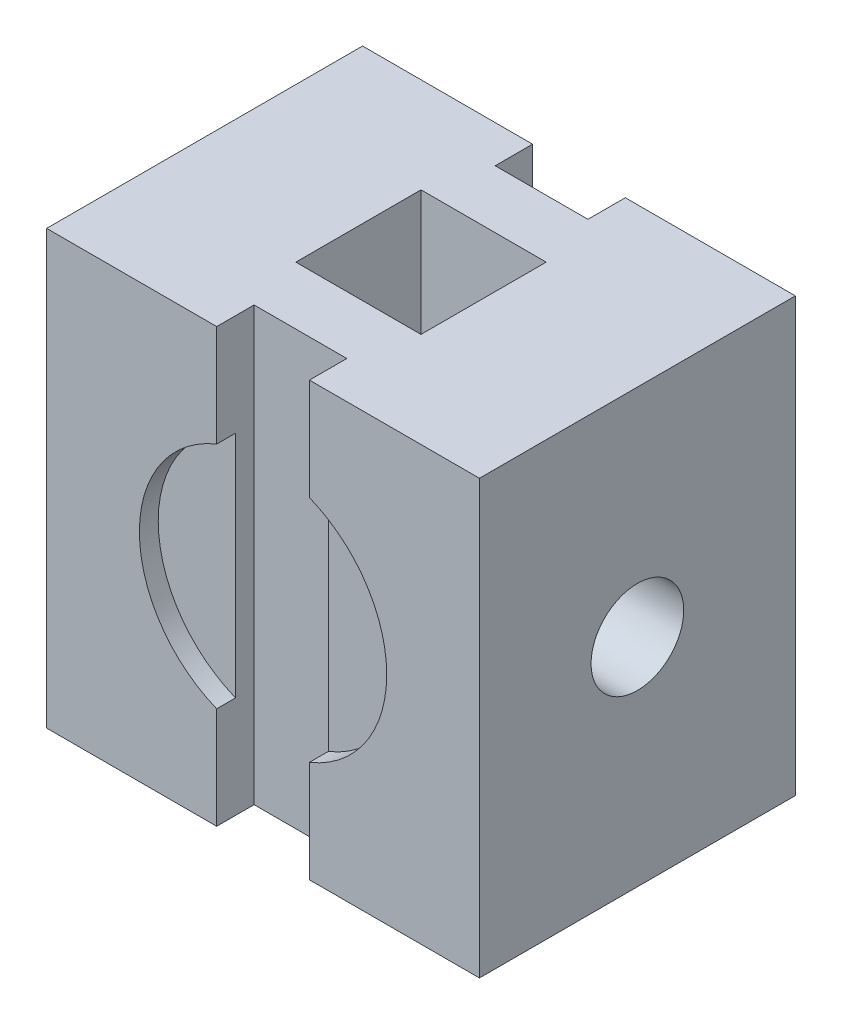
ISO-10303-21;
HEADER;
FILE_DESCRIPTION(('STEP AP214'),'2;1');
FILE_NAME('part.step','',(''),(''),'','','');
FILE_SCHEMA(('AUTOMOTIVE_DESIGN { 1 0 10303 214 1 1 1 1 }'));
ENDSEC;
DATA;
#1=APPLICATION_CONTEXT('core data for automotive mechanical design processes');
#2=APPLICATION_PROTOCOL_DEFINITION('international standard','automotive_design',2000,#1);
#3=PRODUCT_CONTEXT('',#1,'mechanical');
#4=PRODUCT('Part','Part','',(#3));
#5=PRODUCT_RELATED_PRODUCT_CATEGORY('part','',(#4));
#6=PRODUCT_DEFINITION_FORMATION('','',#4);
#7=PRODUCT_DEFINITION_CONTEXT('part definition',#1,'design');
#8=PRODUCT_DEFINITION('design','',#6,#7);
#9=PRODUCT_DEFINITION_SHAPE('','',#8);
#10=(LENGTH_UNIT() NAMED_UNIT(*) SI_UNIT(.MILLI.,.METRE.));
#11=(NAMED_UNIT(*) PLANE_ANGLE_UNIT() SI_UNIT($,.RADIAN.));
#12=(NAMED_UNIT(*) SI_UNIT($,.STERADIAN.) SOLID_ANGLE_UNIT());
#13=UNCERTAINTY_MEASURE_WITH_UNIT(LENGTH_MEASURE(1.E-05),#10,'distance_accuracy_value','');
#14=(GEOMETRIC_REPRESENTATION_CONTEXT(3) GLOBAL_UNCERTAINTY_ASSIGNED_CONTEXT((#13)) GLOBAL_UNIT_ASSIGNED_CONTEXT((#10,
#11,#12)) REPRESENTATION_CONTEXT('',''));
#15=CARTESIAN_POINT('',(0.,0.,0.));
#16=DIRECTION('',(0.,0.,1.));
#17=DIRECTION('',(1.,0.,0.));
#18=AXIS2_PLACEMENT_3D('',#15,#16,#17);
#19=CARTESIAN_POINT('',(-23.335,23.335,83.0333469559524));
#20=DIRECTION('',(0.,-1.,0.));
#21=DIRECTION('',(0.,0.,-1.));
#22=AXIS2_PLACEMENT_3D('',#19,#20,#21);
#23=PLANE('',#22);
#24=DIRECTION('',(-1.,0.,0.));
#25=VECTOR('',#24,1.);
#26=CARTESIAN_POINT('',(-6.75,23.335,-6.75));
#27=LINE('',#26,#25);
#28=CARTESIAN_POINT('',(6.75,23.335,-6.75000000000001));
#29=VERTEX_POINT('',#28);
#30=CARTESIAN_POINT('',(-6.75,23.335,-6.75));
#31=VERTEX_POINT('',#30);
#32=EDGE_CURVE('E320',#29,#31,#27,.T.);
#33=ORIENTED_EDGE('',*,*,#32,.F.);
#34=DIRECTION('',(0.,0.,-1.));
#35=VECTOR('',#34,1.);
#36=CARTESIAN_POINT('',(6.75,23.335,6.75));
#37=LINE('',#36,#35);
#38=CARTESIAN_POINT('',(6.75,23.335,6.75));
#39=VERTEX_POINT('',#38);
#40=EDGE_CURVE('E318',#39,#29,#37,.T.);
#41=ORIENTED_EDGE('',*,*,#40,.F.);
#42=DIRECTION('',(1.,0.,0.));
#43=VECTOR('',#42,1.);
#44=CARTESIAN_POINT('',(-6.75,23.335,6.75));
#45=LINE('',#44,#43);
#46=CARTESIAN_POINT('',(-6.75,23.335,6.75));
#47=VERTEX_POINT('',#46);
#48=EDGE_CURVE('E326',#47,#39,#45,.T.);
#49=ORIENTED_EDGE('',*,*,#48,.F.);
#50=DIRECTION('',(0.,0.,1.));
#51=VECTOR('',#50,1.);
#52=CARTESIAN_POINT('',(-6.75,23.335,6.75));
#53=LINE('',#52,#51);
#54=EDGE_CURVE('E323',#31,#47,#53,.T.);
#55=ORIENTED_EDGE('',*,*,#54,.F.);
#56=EDGE_LOOP('',(#33,#41,#49,#55));
#57=FACE_BOUND('',#56,.T.);
#58=DIRECTION('',(0.,0.,-1.));
#59=VECTOR('',#58,1.);
#60=CARTESIAN_POINT('',(-5.,23.335,36.7293295574116));
#61=LINE('',#60,#59);
#62=CARTESIAN_POINT('',(-5.,23.335,-13.));
#63=VERTEX_POINT('',#62);
#64=CARTESIAN_POINT('',(-5.,23.335,-17.032));
#65=VERTEX_POINT('',#64);
#66=EDGE_CURVE('E249',#63,#65,#61,.T.);
#67=ORIENTED_EDGE('',*,*,#66,.T.);
#68=DIRECTION('',(1.,0.,0.));
#69=VECTOR('',#68,1.);
#70=CARTESIAN_POINT('',(-23.335,23.335,-17.032));
#71=LINE('',#70,#69);
#72=CARTESIAN_POINT('',(-23.335,23.335,-17.032));
#73=VERTEX_POINT('',#72);
#74=EDGE_CURVE('E356',#73,#65,#71,.T.);
#75=ORIENTED_EDGE('',*,*,#74,.F.);
#76=DIRECTION('',(0.,0.,-1.));
#77=VECTOR('',#76,1.);
#78=CARTESIAN_POINT('',(-23.335,23.335,83.0333469559524));
#79=LINE('',#78,#77);
#80=CARTESIAN_POINT('',(-23.335,23.335,17.032));
#81=VERTEX_POINT('',#80);
#82=EDGE_CURVE('E377',#81,#73,#79,.T.);
#83=ORIENTED_EDGE('',*,*,#82,.F.);
#84=DIRECTION('',(-1.,0.,0.));
#85=VECTOR('',#84,1.);
#86=CARTESIAN_POINT('',(-23.335,23.335,17.032));
#87=LINE('',#86,#85);
#88=CARTESIAN_POINT('',(-5.,23.335,17.032));
#89=VERTEX_POINT('',#88);
#90=EDGE_CURVE('E366',#89,#81,#87,.T.);
#91=ORIENTED_EDGE('',*,*,#90,.F.);
#92=DIRECTION('',(0.,0.,1.));
#93=VECTOR('',#92,1.);
#94=CARTESIAN_POINT('',(-5.,23.335,-36.7293295574116));
#95=LINE('',#94,#93);
#96=CARTESIAN_POINT('',(-5.,23.335,13.));
#97=VERTEX_POINT('',#96);
#98=EDGE_CURVE('E278',#97,#89,#95,.T.);
#99=ORIENTED_EDGE('',*,*,#98,.F.);
#100=DIRECTION('',(-1.,0.,0.));
#101=VECTOR('',#100,1.);
#102=CARTESIAN_POINT('',(-5.,23.335,13.));
#103=LINE('',#102,#101);
#104=CARTESIAN_POINT('',(5.,23.335,13.));
#105=VERTEX_POINT('',#104);
#106=EDGE_CURVE('E259',#105,#97,#103,.T.);
#107=ORIENTED_EDGE('',*,*,#106,.F.);
#108=DIRECTION('',(0.,0.,1.));
#109=VECTOR('',#108,1.);
#110=CARTESIAN_POINT('',(5.,23.335,-36.7293295574116));
#111=LINE('',#110,#109);
#112=CARTESIAN_POINT('',(5.,23.335,17.032));
#113=VERTEX_POINT('',#112);
#114=EDGE_CURVE('E280',#105,#113,#111,.T.);
#115=ORIENTED_EDGE('',*,*,#114,.T.);
#116=CARTESIAN_POINT('',(23.335,23.335,17.032));
#117=VERTEX_POINT('',#116);
#118=EDGE_CURVE('E363',#117,#113,#87,.T.);
#119=ORIENTED_EDGE('',*,*,#118,.F.);
#120=DIRECTION('',(0.,0.,-1.));
#121=VECTOR('',#120,1.);
#122=CARTESIAN_POINT('',(23.335,23.335,83.0333469559524));
#123=LINE('',#122,#121);
#124=CARTESIAN_POINT('',(23.335,23.335,-17.032));
#125=VERTEX_POINT('',#124);
#126=EDGE_CURVE('E374',#117,#125,#123,.T.);
#127=ORIENTED_EDGE('',*,*,#126,.T.);
#128=CARTESIAN_POINT('',(5.,23.335,-17.032));
#129=VERTEX_POINT('',#128);
#130=EDGE_CURVE('E355',#129,#125,#71,.T.);
#131=ORIENTED_EDGE('',*,*,#130,.F.);
#132=DIRECTION('',(0.,0.,-1.));
#133=VECTOR('',#132,1.);
#134=CARTESIAN_POINT('',(5.,23.335,36.7293295574116));
#135=LINE('',#134,#133);
#136=CARTESIAN_POINT('',(5.,23.335,-13.));
#137=VERTEX_POINT('',#136);
#138=EDGE_CURVE('E225',#137,#129,#135,.T.);
#139=ORIENTED_EDGE('',*,*,#138,.F.);
#140=DIRECTION('',(-1.,0.,0.));
#141=VECTOR('',#140,1.);
#142=CARTESIAN_POINT('',(-5.,23.335,-13.));
#143=LINE('',#142,#141);
#144=EDGE_CURVE('E214',#137,#63,#143,.T.);
#145=ORIENTED_EDGE('',*,*,#144,.T.);
#146=EDGE_LOOP('',(#67,#75,#83,#91,#99,#107,#115,#119,#127,#131,#139,#145));
#147=FACE_BOUND('',#146,.T.);
#148=ADVANCED_FACE('F46',(#57,#147),#23,.F.);
#149=CARTESIAN_POINT('',(-23.335,-23.335,83.0333469559524));
#150=DIRECTION('',(0.,1.,0.));
#151=DIRECTION('',(0.,0.,1.));
#152=AXIS2_PLACEMENT_3D('',#149,#150,#151);
#153=PLANE('',#152);
#154=DIRECTION('',(0.,0.,-1.));
#155=VECTOR('',#154,1.);
#156=CARTESIAN_POINT('',(-5.,-23.335,36.7293295574116));
#157=LINE('',#156,#155);
#158=CARTESIAN_POINT('',(-5.,-23.335,-13.));
#159=VERTEX_POINT('',#158);
#160=CARTESIAN_POINT('',(-5.,-23.335,-17.032));
#161=VERTEX_POINT('',#160);
#162=EDGE_CURVE('E229',#159,#161,#157,.T.);
#163=ORIENTED_EDGE('',*,*,#162,.F.);
#164=DIRECTION('',(-1.,0.,0.));
#165=VECTOR('',#164,1.);
#166=CARTESIAN_POINT('',(-5.,-23.335,-13.));
#167=LINE('',#166,#165);
#168=CARTESIAN_POINT('',(5.,-23.335,-13.));
#169=VERTEX_POINT('',#168);
#170=EDGE_CURVE('E211',#169,#159,#167,.T.);
#171=ORIENTED_EDGE('',*,*,#170,.F.);
#172=DIRECTION('',(0.,0.,-1.));
#173=VECTOR('',#172,1.);
#174=CARTESIAN_POINT('',(5.,-23.335,36.7293295574116));
#175=LINE('',#174,#173);
#176=CARTESIAN_POINT('',(5.,-23.335,-17.032));
#177=VERTEX_POINT('',#176);
#178=EDGE_CURVE('E218',#169,#177,#175,.T.);
#179=ORIENTED_EDGE('',*,*,#178,.T.);
#180=DIRECTION('',(-1.,0.,0.));
#181=VECTOR('',#180,1.);
#182=CARTESIAN_POINT('',(-23.335,-23.335,-17.032));
#183=LINE('',#182,#181);
#184=CARTESIAN_POINT('',(23.335,-23.335,-17.032));
#185=VERTEX_POINT('',#184);
#186=EDGE_CURVE('E350',#185,#177,#183,.T.);
#187=ORIENTED_EDGE('',*,*,#186,.F.);
#188=DIRECTION('',(0.,0.,-1.));
#189=VECTOR('',#188,1.);
#190=CARTESIAN_POINT('',(23.335,-23.335,83.0333469559524));
#191=LINE('',#190,#189);
#192=CARTESIAN_POINT('',(23.335,-23.335,17.032));
#193=VERTEX_POINT('',#192);
#194=EDGE_CURVE('E359',#193,#185,#191,.T.);
#195=ORIENTED_EDGE('',*,*,#194,.F.);
#196=DIRECTION('',(1.,0.,0.));
#197=VECTOR('',#196,1.);
#198=CARTESIAN_POINT('',(-23.335,-23.335,17.032));
#199=LINE('',#198,#197);
#200=CARTESIAN_POINT('',(5.,-23.335,17.032));
#201=VERTEX_POINT('',#200);
#202=EDGE_CURVE('E373',#201,#193,#199,.T.);
#203=ORIENTED_EDGE('',*,*,#202,.F.);
#204=DIRECTION('',(0.,0.,1.));
#205=VECTOR('',#204,1.);
#206=CARTESIAN_POINT('',(5.,-23.335,-36.7293295574116));
#207=LINE('',#206,#205);
#208=CARTESIAN_POINT('',(5.,-23.335,13.));
#209=VERTEX_POINT('',#208);
#210=EDGE_CURVE('E275',#209,#201,#207,.T.);
#211=ORIENTED_EDGE('',*,*,#210,.F.);
#212=DIRECTION('',(-1.,0.,0.));
#213=VECTOR('',#212,1.);
#214=CARTESIAN_POINT('',(-5.,-23.335,13.));
#215=LINE('',#214,#213);
#216=CARTESIAN_POINT('',(-5.,-23.335,13.));
#217=VERTEX_POINT('',#216);
#218=EDGE_CURVE('E265',#209,#217,#215,.T.);
#219=ORIENTED_EDGE('',*,*,#218,.T.);
#220=DIRECTION('',(0.,0.,1.));
#221=VECTOR('',#220,1.);
#222=CARTESIAN_POINT('',(-5.,-23.335,-36.7293295574116));
#223=LINE('',#222,#221);
#224=CARTESIAN_POINT('',(-5.,-23.335,17.032));
#225=VERTEX_POINT('',#224);
#226=EDGE_CURVE('E263',#217,#225,#223,.T.);
#227=ORIENTED_EDGE('',*,*,#226,.T.);
#228=CARTESIAN_POINT('',(-23.335,-23.335,17.032));
#229=VERTEX_POINT('',#228);
#230=EDGE_CURVE('E370',#229,#225,#199,.T.);
#231=ORIENTED_EDGE('',*,*,#230,.F.);
#232=DIRECTION('',(0.,0.,-1.));
#233=VECTOR('',#232,1.);
#234=CARTESIAN_POINT('',(-23.335,-23.335,83.0333469559524));
#235=LINE('',#234,#233);
#236=CARTESIAN_POINT('',(-23.335,-23.335,-17.032));
#237=VERTEX_POINT('',#236);
#238=EDGE_CURVE('E379',#229,#237,#235,.T.);
#239=ORIENTED_EDGE('',*,*,#238,.T.);
#240=EDGE_CURVE('E349',#161,#237,#183,.T.);
#241=ORIENTED_EDGE('',*,*,#240,.F.);
#242=EDGE_LOOP('',(#163,#171,#179,#187,#195,#203,#211,#219,#227,#231,#239,#241));
#243=FACE_BOUND('',#242,.T.);
#244=ADVANCED_FACE('F227',(#243),#153,.F.);
#245=CARTESIAN_POINT('',(0.,0.,-17.032));
#246=DIRECTION('',(0.,0.,1.));
#247=DIRECTION('',(1.,0.,0.));
#248=AXIS2_PLACEMENT_3D('',#245,#246,#247);
#249=PLANE('',#248);
#250=DIRECTION('',(0.,1.,0.));
#251=VECTOR('',#250,1.);
#252=CARTESIAN_POINT('',(-5.,-23.335,-17.032));
#253=LINE('',#252,#251);
#254=CARTESIAN_POINT('',(-5.,-12.3621286597414,-17.032));
#255=VERTEX_POINT('',#254);
#256=EDGE_CURVE('E245',#161,#255,#253,.T.);
#257=ORIENTED_EDGE('',*,*,#256,.F.);
#258=ORIENTED_EDGE('',*,*,#240,.T.);
#259=DIRECTION('',(0.,1.,0.));
#260=VECTOR('',#259,1.);
#261=CARTESIAN_POINT('',(-23.335,-23.335,-17.032));
#262=LINE('',#261,#260);
#263=EDGE_CURVE('E342',#237,#73,#262,.T.);
#264=ORIENTED_EDGE('',*,*,#263,.T.);
#265=ORIENTED_EDGE('',*,*,#74,.T.);
#266=CARTESIAN_POINT('',(-5.,12.3621286597414,-17.032));
#267=VERTEX_POINT('',#266);
#268=EDGE_CURVE('E247',#267,#65,#253,.T.);
#269=ORIENTED_EDGE('',*,*,#268,.F.);
#270=CARTESIAN_POINT('',(0.,0.,-17.032));
#271=DIRECTION('',(0.,0.,1.));
#272=DIRECTION('',(1.,0.,0.));
#273=AXIS2_PLACEMENT_3D('',#270,#271,#272);
#274=CIRCLE('',#273,13.335);
#275=EDGE_CURVE('E303',#267,#255,#274,.T.);
#276=ORIENTED_EDGE('',*,*,#275,.T.);
#277=EDGE_LOOP('',(#257,#258,#264,#265,#269,#276));
#278=FACE_BOUND('',#277,.T.);
#279=ADVANCED_FACE('F419',(#278),#249,.F.);
#280=CARTESIAN_POINT('',(0.,0.,-17.032));
#281=DIRECTION('',(0.,0.,1.));
#282=DIRECTION('',(1.,0.,0.));
#283=AXIS2_PLACEMENT_3D('',#280,#281,#282);
#284=CYLINDRICAL_SURFACE('',#283,13.335);
#285=DIRECTION('',(0.,0.,1.));
#286=VECTOR('',#285,1.);
#287=CARTESIAN_POINT('',(-5.,12.3621286597414,-17.032));
#288=LINE('',#287,#286);
#289=CARTESIAN_POINT('',(-5.,12.3621286597414,-15.));
#290=VERTEX_POINT('',#289);
#291=EDGE_CURVE('E252',#290,#267,#288,.F.);
#292=ORIENTED_EDGE('',*,*,#291,.F.);
#293=CARTESIAN_POINT('',(0.,0.,-15.));
#294=DIRECTION('',(0.,0.,1.));
#295=DIRECTION('',(1.,0.,0.));
#296=AXIS2_PLACEMENT_3D('',#293,#294,#295);
#297=CIRCLE('',#296,13.335);
#298=CARTESIAN_POINT('',(-5.,-12.3621286597414,-15.));
#299=VERTEX_POINT('',#298);
#300=EDGE_CURVE('E307',#290,#299,#297,.T.);
#301=ORIENTED_EDGE('',*,*,#300,.T.);
#302=DIRECTION('',(0.,0.,1.));
#303=VECTOR('',#302,1.);
#304=CARTESIAN_POINT('',(-5.,-12.3621286597414,-17.032));
#305=LINE('',#304,#303);
#306=EDGE_CURVE('E256',#255,#299,#305,.T.);
#307=ORIENTED_EDGE('',*,*,#306,.F.);
#308=ORIENTED_EDGE('',*,*,#275,.F.);
#309=EDGE_LOOP('',(#292,#301,#307,#308));
#310=FACE_BOUND('',#309,.T.);
#311=ADVANCED_FACE('F484',(#310),#284,.F.);
#312=CARTESIAN_POINT('',(0.,0.,-15.));
#313=DIRECTION('',(0.,0.,1.));
#314=DIRECTION('',(1.,0.,0.));
#315=AXIS2_PLACEMENT_3D('',#312,#313,#314);
#316=PLANE('',#315);
#317=DIRECTION('',(0.,1.,0.));
#318=VECTOR('',#317,1.);
#319=CARTESIAN_POINT('',(-5.,0.,-15.));
#320=LINE('',#319,#318);
#321=EDGE_CURVE('E254',#299,#290,#320,.T.);
#322=ORIENTED_EDGE('',*,*,#321,.F.);
#323=ORIENTED_EDGE('',*,*,#300,.F.);
#324=EDGE_LOOP('',(#322,#323));
#325=FACE_BOUND('',#324,.T.);
#326=ADVANCED_FACE('F487',(#325),#316,.F.);
#327=CARTESIAN_POINT('',(0.,0.,17.032));
#328=DIRECTION('',(0.,0.,1.));
#329=DIRECTION('',(1.,0.,0.));
#330=AXIS2_PLACEMENT_3D('',#327,#328,#329);
#331=PLANE('',#330);
#332=ORIENTED_EDGE('',*,*,#230,.T.);
#333=DIRECTION('',(0.,1.,0.));
#334=VECTOR('',#333,1.);
#335=CARTESIAN_POINT('',(-5.,-23.335,17.032));
#336=LINE('',#335,#334);
#337=CARTESIAN_POINT('',(-5.,-12.3621286597414,17.032));
#338=VERTEX_POINT('',#337);
#339=EDGE_CURVE('E272',#225,#338,#336,.T.);
#340=ORIENTED_EDGE('',*,*,#339,.T.);
#341=CARTESIAN_POINT('',(0.,0.,17.032));
#342=DIRECTION('',(0.,0.,1.));
#343=DIRECTION('',(1.,0.,0.));
#344=AXIS2_PLACEMENT_3D('',#341,#342,#343);
#345=CIRCLE('',#344,13.335);
#346=CARTESIAN_POINT('',(-5.,12.3621286597414,17.032));
#347=VERTEX_POINT('',#346);
#348=EDGE_CURVE('E298',#347,#338,#345,.T.);
#349=ORIENTED_EDGE('',*,*,#348,.F.);
#350=EDGE_CURVE('E271',#347,#89,#336,.T.);
#351=ORIENTED_EDGE('',*,*,#350,.T.);
#352=ORIENTED_EDGE('',*,*,#90,.T.);
#353=DIRECTION('',(0.,-1.,0.));
#354=VECTOR('',#353,1.);
#355=CARTESIAN_POINT('',(-23.335,-23.335,17.032));
#356=LINE('',#355,#354);
#357=EDGE_CURVE('E360',#81,#229,#356,.T.);
#358=ORIENTED_EDGE('',*,*,#357,.T.);
#359=EDGE_LOOP('',(#332,#340,#349,#351,#352,#358));
#360=FACE_BOUND('',#359,.T.);
#361=ADVANCED_FACE('F461',(#360),#331,.T.);
#362=CARTESIAN_POINT('',(0.,0.,17.032));
#363=DIRECTION('',(0.,0.,-1.));
#364=DIRECTION('',(-1.,0.,0.));
#365=AXIS2_PLACEMENT_3D('',#362,#363,#364);
#366=CYLINDRICAL_SURFACE('',#365,13.335);
#367=ORIENTED_EDGE('',*,*,#348,.T.);
#368=DIRECTION('',(0.,0.,-1.));
#369=VECTOR('',#368,1.);
#370=CARTESIAN_POINT('',(-5.,-12.3621286597414,17.032));
#371=LINE('',#370,#369);
#372=CARTESIAN_POINT('',(-5.,-12.3621286597414,15.));
#373=VERTEX_POINT('',#372);
#374=EDGE_CURVE('E291',#338,#373,#371,.T.);
#375=ORIENTED_EDGE('',*,*,#374,.T.);
#376=CARTESIAN_POINT('',(0.,0.,15.));
#377=DIRECTION('',(0.,0.,1.));
#378=DIRECTION('',(1.,0.,0.));
#379=AXIS2_PLACEMENT_3D('',#376,#377,#378);
#380=CIRCLE('',#379,13.335);
#381=CARTESIAN_POINT('',(-5.,12.3621286597414,15.));
#382=VERTEX_POINT('',#381);
#383=EDGE_CURVE('E299',#382,#373,#380,.T.);
#384=ORIENTED_EDGE('',*,*,#383,.F.);
#385=DIRECTION('',(0.,0.,-1.));
#386=VECTOR('',#385,1.);
#387=CARTESIAN_POINT('',(-5.,12.3621286597414,17.032));
#388=LINE('',#387,#386);
#389=EDGE_CURVE('E288',#382,#347,#388,.F.);
#390=ORIENTED_EDGE('',*,*,#389,.T.);
#391=EDGE_LOOP('',(#367,#375,#384,#390));
#392=FACE_BOUND('',#391,.T.);
#393=ADVANCED_FACE('F407',(#392),#366,.F.);
#394=CARTESIAN_POINT('',(0.,0.,15.));
#395=DIRECTION('',(0.,0.,1.));
#396=DIRECTION('',(1.,0.,0.));
#397=AXIS2_PLACEMENT_3D('',#394,#395,#396);
#398=PLANE('',#397);
#399=ORIENTED_EDGE('',*,*,#383,.T.);
#400=DIRECTION('',(0.,1.,0.));
#401=VECTOR('',#400,1.);
#402=CARTESIAN_POINT('',(-5.,0.,15.));
#403=LINE('',#402,#401);
#404=EDGE_CURVE('E13',#373,#382,#403,.T.);
#405=ORIENTED_EDGE('',*,*,#404,.T.);
#406=EDGE_LOOP('',(#399,#405));
#407=FACE_BOUND('',#406,.T.);
#408=ADVANCED_FACE('F398',(#407),#398,.T.);
#409=CARTESIAN_POINT('',(23.335,0.,0.));
#410=DIRECTION('',(-1.,0.,0.));
#411=DIRECTION('',(0.,0.,1.));
#412=AXIS2_PLACEMENT_3D('',#409,#410,#411);
#413=CYLINDRICAL_SURFACE('',#412,5.);
#414=CARTESIAN_POINT('',(6.75,0.,0.));
#415=DIRECTION('',(1.,0.,0.));
#416=DIRECTION('',(0.,0.,-1.));
#417=AXIS2_PLACEMENT_3D('',#414,#415,#416);
#418=CIRCLE('',#417,5.);
#419=CARTESIAN_POINT('',(6.75,0.,-5.));
#420=VERTEX_POINT('',#419);
#421=EDGE_CURVE('E346',#420,#420,#418,.F.);
#422=ORIENTED_EDGE('',*,*,#421,.T.);
#423=EDGE_LOOP('',(#422));
#424=FACE_BOUND('',#423,.T.);
#425=CARTESIAN_POINT('',(23.335,0.,0.));
#426=DIRECTION('',(-1.,0.,0.));
#427=DIRECTION('',(0.,0.,1.));
#428=AXIS2_PLACEMENT_3D('',#425,#426,#427);
#429=CIRCLE('',#428,5.);
#430=CARTESIAN_POINT('',(23.335,0.,5.));
#431=VERTEX_POINT('',#430);
#432=EDGE_CURVE('E339',#431,#431,#429,.T.);
#433=ORIENTED_EDGE('',*,*,#432,.F.);
#434=EDGE_LOOP('',(#433));
#435=FACE_BOUND('',#434,.T.);
#436=ADVANCED_FACE('F410',(#424,#435),#413,.F.);
#437=CARTESIAN_POINT('',(23.335,-23.335,83.0333469559524));
#438=DIRECTION('',(-1.,0.,0.));
#439=DIRECTION('',(0.,0.,1.));
#440=AXIS2_PLACEMENT_3D('',#437,#438,#439);
#441=PLANE('',#440);
#442=ORIENTED_EDGE('',*,*,#432,.T.);
#443=EDGE_LOOP('',(#442));
#444=FACE_BOUND('',#443,.T.);
#445=DIRECTION('',(0.,1.,0.));
#446=VECTOR('',#445,1.);
#447=CARTESIAN_POINT('',(23.335,-23.335,17.032));
#448=LINE('',#447,#446);
#449=EDGE_CURVE('E367',#193,#117,#448,.T.);
#450=ORIENTED_EDGE('',*,*,#449,.F.);
#451=ORIENTED_EDGE('',*,*,#194,.T.);
#452=DIRECTION('',(0.,-1.,0.));
#453=VECTOR('',#452,1.);
#454=CARTESIAN_POINT('',(23.335,-23.335,-17.032));
#455=LINE('',#454,#453);
#456=EDGE_CURVE('E352',#125,#185,#455,.T.);
#457=ORIENTED_EDGE('',*,*,#456,.F.);
#458=ORIENTED_EDGE('',*,*,#126,.F.);
#459=EDGE_LOOP('',(#450,#451,#457,#458));
#460=FACE_BOUND('',#459,.T.);
#461=ADVANCED_FACE('F425',(#444,#460),#441,.F.);
#462=CARTESIAN_POINT('',(-23.335,-23.335,83.0333469559524));
#463=DIRECTION('',(1.,0.,0.));
#464=DIRECTION('',(0.,0.,-1.));
#465=AXIS2_PLACEMENT_3D('',#462,#463,#464);
#466=PLANE('',#465);
#467=CARTESIAN_POINT('',(-23.335,0.,0.));
#468=DIRECTION('',(-1.,0.,0.));
#469=DIRECTION('',(0.,0.,1.));
#470=AXIS2_PLACEMENT_3D('',#467,#468,#469);
#471=CIRCLE('',#470,5.);
#472=CARTESIAN_POINT('',(-23.335,0.,5.));
#473=VERTEX_POINT('',#472);
#474=EDGE_CURVE('E343',#473,#473,#471,.T.);
#475=ORIENTED_EDGE('',*,*,#474,.F.);
#476=EDGE_LOOP('',(#475));
#477=FACE_BOUND('',#476,.T.);
#478=ORIENTED_EDGE('',*,*,#357,.F.);
#479=ORIENTED_EDGE('',*,*,#82,.T.);
#480=ORIENTED_EDGE('',*,*,#263,.F.);
#481=ORIENTED_EDGE('',*,*,#238,.F.);
#482=EDGE_LOOP('',(#478,#479,#480,#481));
#483=FACE_BOUND('',#482,.T.);
#484=ADVANCED_FACE('F424',(#477,#483),#466,.F.);
#485=DIRECTION('',(0.,1.,0.));
#486=VECTOR('',#485,1.);
#487=CARTESIAN_POINT('',(5.,-23.335,17.032));
#488=LINE('',#487,#486);
#489=CARTESIAN_POINT('',(5.,-12.3621286597414,17.032));
#490=VERTEX_POINT('',#489);
#491=EDGE_CURVE('E269',#201,#490,#488,.T.);
#492=ORIENTED_EDGE('',*,*,#491,.F.);
#493=ORIENTED_EDGE('',*,*,#202,.T.);
#494=ORIENTED_EDGE('',*,*,#449,.T.);
#495=ORIENTED_EDGE('',*,*,#118,.T.);
#496=CARTESIAN_POINT('',(5.,12.3621286597414,17.032));
#497=VERTEX_POINT('',#496);
#498=EDGE_CURVE('E258',#497,#113,#488,.T.);
#499=ORIENTED_EDGE('',*,*,#498,.F.);
#500=EDGE_CURVE('E295',#490,#497,#345,.T.);
#501=ORIENTED_EDGE('',*,*,#500,.F.);
#502=EDGE_LOOP('',(#492,#493,#494,#495,#499,#501));
#503=FACE_BOUND('',#502,.T.);
#504=ADVANCED_FACE('F48',(#503),#331,.T.);
#505=ORIENTED_EDGE('',*,*,#186,.T.);
#506=DIRECTION('',(0.,1.,0.));
#507=VECTOR('',#506,1.);
#508=CARTESIAN_POINT('',(5.,-23.335,-17.032));
#509=LINE('',#508,#507);
#510=CARTESIAN_POINT('',(5.,-12.3621286597414,-17.032));
#511=VERTEX_POINT('',#510);
#512=EDGE_CURVE('E221',#177,#511,#509,.T.);
#513=ORIENTED_EDGE('',*,*,#512,.T.);
#514=CARTESIAN_POINT('',(5.,12.3621286597414,-17.032));
#515=VERTEX_POINT('',#514);
#516=EDGE_CURVE('E304',#511,#515,#274,.T.);
#517=ORIENTED_EDGE('',*,*,#516,.T.);
#518=EDGE_CURVE('E241',#515,#129,#509,.T.);
#519=ORIENTED_EDGE('',*,*,#518,.T.);
#520=ORIENTED_EDGE('',*,*,#130,.T.);
#521=ORIENTED_EDGE('',*,*,#456,.T.);
#522=EDGE_LOOP('',(#505,#513,#517,#519,#520,#521));
#523=FACE_BOUND('',#522,.T.);
#524=ADVANCED_FACE('F449',(#523),#249,.F.);
#525=CARTESIAN_POINT('',(-6.75,0.,0.));
#526=DIRECTION('',(-1.,0.,0.));
#527=DIRECTION('',(0.,0.,1.));
#528=AXIS2_PLACEMENT_3D('',#525,#526,#527);
#529=CIRCLE('',#528,5.);
#530=CARTESIAN_POINT('',(-6.75,0.,5.));
#531=VERTEX_POINT('',#530);
#532=EDGE_CURVE('E338',#531,#531,#529,.F.);
#533=ORIENTED_EDGE('',*,*,#532,.T.);
#534=EDGE_LOOP('',(#533));
#535=FACE_BOUND('',#534,.T.);
#536=ORIENTED_EDGE('',*,*,#474,.T.);
#537=EDGE_LOOP('',(#536));
#538=FACE_BOUND('',#537,.T.);
#539=ADVANCED_FACE('F437',(#535,#538),#413,.F.);
#540=CARTESIAN_POINT('',(6.75,-42.4268830920368,6.75));
#541=DIRECTION('',(1.,0.,0.));
#542=DIRECTION('',(0.,0.,-1.));
#543=AXIS2_PLACEMENT_3D('',#540,#541,#542);
#544=PLANE('',#543);
#545=DIRECTION('',(0.,0.,1.));
#546=VECTOR('',#545,1.);
#547=CARTESIAN_POINT('',(6.75,-8.335,6.75));
#548=LINE('',#547,#546);
#549=CARTESIAN_POINT('',(6.75,-8.335,-6.75));
#550=VERTEX_POINT('',#549);
#551=CARTESIAN_POINT('',(6.75,-8.335,6.75));
#552=VERTEX_POINT('',#551);
#553=EDGE_CURVE('E315',#550,#552,#548,.T.);
#554=ORIENTED_EDGE('',*,*,#553,.T.);
#555=DIRECTION('',(0.,1.,0.));
#556=VECTOR('',#555,1.);
#557=CARTESIAN_POINT('',(6.75,-42.4268830920368,6.75));
#558=LINE('',#557,#556);
#559=EDGE_CURVE('E313',#552,#39,#558,.T.);
#560=ORIENTED_EDGE('',*,*,#559,.T.);
#561=ORIENTED_EDGE('',*,*,#40,.T.);
#562=DIRECTION('',(0.,1.,0.));
#563=VECTOR('',#562,1.);
#564=CARTESIAN_POINT('',(6.75,-42.4268830920368,-6.75));
#565=LINE('',#564,#563);
#566=EDGE_CURVE('E329',#550,#29,#565,.T.);
#567=ORIENTED_EDGE('',*,*,#566,.F.);
#568=EDGE_LOOP('',(#554,#560,#561,#567));
#569=FACE_BOUND('',#568,.T.);
#570=ORIENTED_EDGE('',*,*,#421,.F.);
#571=EDGE_LOOP('',(#570));
#572=FACE_BOUND('',#571,.T.);
#573=ADVANCED_FACE('F522',(#569,#572),#544,.F.);
#574=CARTESIAN_POINT('',(-6.75,-42.4268830920368,6.75));
#575=DIRECTION('',(-1.,0.,0.));
#576=DIRECTION('',(0.,0.,1.));
#577=AXIS2_PLACEMENT_3D('',#574,#575,#576);
#578=PLANE('',#577);
#579=DIRECTION('',(0.,0.,-1.));
#580=VECTOR('',#579,1.);
#581=CARTESIAN_POINT('',(-6.75,-8.335,6.75));
#582=LINE('',#581,#580);
#583=CARTESIAN_POINT('',(-6.75,-8.335,6.75));
#584=VERTEX_POINT('',#583);
#585=CARTESIAN_POINT('',(-6.75,-8.335,-6.75));
#586=VERTEX_POINT('',#585);
#587=EDGE_CURVE('E310',#584,#586,#582,.T.);
#588=ORIENTED_EDGE('',*,*,#587,.T.);
#589=DIRECTION('',(0.,1.,0.));
#590=VECTOR('',#589,1.);
#591=CARTESIAN_POINT('',(-6.75,-42.4268830920368,-6.75));
#592=LINE('',#591,#590);
#593=EDGE_CURVE('E333',#586,#31,#592,.T.);
#594=ORIENTED_EDGE('',*,*,#593,.T.);
#595=ORIENTED_EDGE('',*,*,#54,.T.);
#596=DIRECTION('',(0.,1.,0.));
#597=VECTOR('',#596,1.);
#598=CARTESIAN_POINT('',(-6.75,-42.4268830920368,6.75));
#599=LINE('',#598,#597);
#600=EDGE_CURVE('E331',#584,#47,#599,.T.);
#601=ORIENTED_EDGE('',*,*,#600,.F.);
#602=EDGE_LOOP('',(#588,#594,#595,#601));
#603=FACE_BOUND('',#602,.T.);
#604=ORIENTED_EDGE('',*,*,#532,.F.);
#605=EDGE_LOOP('',(#604));
#606=FACE_BOUND('',#605,.T.);
#607=ADVANCED_FACE('F518',(#603,#606),#578,.F.);
#608=CARTESIAN_POINT('',(-6.75,-42.4268830920368,6.75));
#609=DIRECTION('',(0.,0.,1.));
#610=DIRECTION('',(1.,0.,0.));
#611=AXIS2_PLACEMENT_3D('',#608,#609,#610);
#612=PLANE('',#611);
#613=DIRECTION('',(-1.,0.,0.));
#614=VECTOR('',#613,1.);
#615=CARTESIAN_POINT('',(-6.75,-8.335,6.75));
#616=LINE('',#615,#614);
#617=EDGE_CURVE('E312',#552,#584,#616,.T.);
#618=ORIENTED_EDGE('',*,*,#617,.T.);
#619=ORIENTED_EDGE('',*,*,#600,.T.);
#620=ORIENTED_EDGE('',*,*,#48,.T.);
#621=ORIENTED_EDGE('',*,*,#559,.F.);
#622=EDGE_LOOP('',(#618,#619,#620,#621));
#623=FACE_BOUND('',#622,.T.);
#624=ADVANCED_FACE('F515',(#623),#612,.F.);
#625=CARTESIAN_POINT('',(-6.75,-42.4268830920368,-6.75));
#626=DIRECTION('',(0.,0.,-1.));
#627=DIRECTION('',(-1.,0.,0.));
#628=AXIS2_PLACEMENT_3D('',#625,#626,#627);
#629=PLANE('',#628);
#630=DIRECTION('',(1.,0.,0.));
#631=VECTOR('',#630,1.);
#632=CARTESIAN_POINT('',(-6.75,-8.335,-6.75));
#633=LINE('',#632,#631);
#634=EDGE_CURVE('E317',#586,#550,#633,.T.);
#635=ORIENTED_EDGE('',*,*,#634,.T.);
#636=ORIENTED_EDGE('',*,*,#566,.T.);
#637=ORIENTED_EDGE('',*,*,#32,.T.);
#638=ORIENTED_EDGE('',*,*,#593,.F.);
#639=EDGE_LOOP('',(#635,#636,#637,#638));
#640=FACE_BOUND('',#639,.T.);
#641=ADVANCED_FACE('F513',(#640),#629,.F.);
#642=CARTESIAN_POINT('',(-23.335,-8.335,83.0333469559524));
#643=DIRECTION('',(0.,1.,0.));
#644=DIRECTION('',(0.,0.,1.));
#645=AXIS2_PLACEMENT_3D('',#642,#643,#644);
#646=PLANE('',#645);
#647=ORIENTED_EDGE('',*,*,#553,.F.);
#648=ORIENTED_EDGE('',*,*,#634,.F.);
#649=ORIENTED_EDGE('',*,*,#587,.F.);
#650=ORIENTED_EDGE('',*,*,#617,.F.);
#651=EDGE_LOOP('',(#647,#648,#649,#650));
#652=FACE_BOUND('',#651,.T.);
#653=ADVANCED_FACE('F498',(#652),#646,.T.);
#654=CARTESIAN_POINT('',(5.,-12.3621286597414,-15.));
#655=VERTEX_POINT('',#654);
#656=CARTESIAN_POINT('',(5.,12.3621286597414,-15.));
#657=VERTEX_POINT('',#656);
#658=EDGE_CURVE('E294',#655,#657,#297,.T.);
#659=ORIENTED_EDGE('',*,*,#658,.T.);
#660=DIRECTION('',(0.,0.,1.));
#661=VECTOR('',#660,1.);
#662=CARTESIAN_POINT('',(5.,12.3621286597414,-17.032));
#663=LINE('',#662,#661);
#664=EDGE_CURVE('E61',#657,#515,#663,.F.);
#665=ORIENTED_EDGE('',*,*,#664,.T.);
#666=ORIENTED_EDGE('',*,*,#516,.F.);
#667=DIRECTION('',(0.,0.,1.));
#668=VECTOR('',#667,1.);
#669=CARTESIAN_POINT('',(5.,-12.3621286597414,-17.032));
#670=LINE('',#669,#668);
#671=EDGE_CURVE('E235',#511,#655,#670,.T.);
#672=ORIENTED_EDGE('',*,*,#671,.T.);
#673=EDGE_LOOP('',(#659,#665,#666,#672));
#674=FACE_BOUND('',#673,.T.);
#675=ADVANCED_FACE('F489',(#674),#284,.F.);
#676=ORIENTED_EDGE('',*,*,#658,.F.);
#677=DIRECTION('',(0.,1.,0.));
#678=VECTOR('',#677,1.);
#679=CARTESIAN_POINT('',(5.,0.,-15.));
#680=LINE('',#679,#678);
#681=EDGE_CURVE('E238',#655,#657,#680,.T.);
#682=ORIENTED_EDGE('',*,*,#681,.T.);
#683=EDGE_LOOP('',(#676,#682));
#684=FACE_BOUND('',#683,.T.);
#685=ADVANCED_FACE('F405',(#684),#316,.F.);
#686=DIRECTION('',(0.,0.,-1.));
#687=VECTOR('',#686,1.);
#688=CARTESIAN_POINT('',(5.,-12.3621286597414,17.032));
#689=LINE('',#688,#687);
#690=CARTESIAN_POINT('',(5.,-12.3621286597414,15.));
#691=VERTEX_POINT('',#690);
#692=EDGE_CURVE('E69',#490,#691,#689,.T.);
#693=ORIENTED_EDGE('',*,*,#692,.F.);
#694=ORIENTED_EDGE('',*,*,#500,.T.);
#695=DIRECTION('',(0.,0.,-1.));
#696=VECTOR('',#695,1.);
#697=CARTESIAN_POINT('',(5.,12.3621286597414,17.032));
#698=LINE('',#697,#696);
#699=CARTESIAN_POINT('',(5.,12.3621286597414,15.));
#700=VERTEX_POINT('',#699);
#701=EDGE_CURVE('E285',#700,#497,#698,.F.);
#702=ORIENTED_EDGE('',*,*,#701,.F.);
#703=EDGE_CURVE('E300',#691,#700,#380,.T.);
#704=ORIENTED_EDGE('',*,*,#703,.F.);
#705=EDGE_LOOP('',(#693,#694,#702,#704));
#706=FACE_BOUND('',#705,.T.);
#707=ADVANCED_FACE('F392',(#706),#366,.F.);
#708=DIRECTION('',(0.,1.,0.));
#709=VECTOR('',#708,1.);
#710=CARTESIAN_POINT('',(5.,0.,15.));
#711=LINE('',#710,#709);
#712=EDGE_CURVE('E54',#691,#700,#711,.T.);
#713=ORIENTED_EDGE('',*,*,#712,.F.);
#714=ORIENTED_EDGE('',*,*,#703,.T.);
#715=EDGE_LOOP('',(#713,#714));
#716=FACE_BOUND('',#715,.T.);
#717=ADVANCED_FACE('F394',(#716),#398,.T.);
#718=CARTESIAN_POINT('',(-5.,-23.335,-36.7293295574116));
#719=DIRECTION('',(1.,0.,0.));
#720=DIRECTION('',(0.,0.,-1.));
#721=AXIS2_PLACEMENT_3D('',#718,#719,#720);
#722=PLANE('',#721);
#723=ORIENTED_EDGE('',*,*,#339,.F.);
#724=ORIENTED_EDGE('',*,*,#226,.F.);
#725=DIRECTION('',(0.,-1.,0.));
#726=VECTOR('',#725,1.);
#727=CARTESIAN_POINT('',(-5.,-23.335,13.));
#728=LINE('',#727,#726);
#729=EDGE_CURVE('E262',#97,#217,#728,.T.);
#730=ORIENTED_EDGE('',*,*,#729,.F.);
#731=ORIENTED_EDGE('',*,*,#98,.T.);
#732=ORIENTED_EDGE('',*,*,#350,.F.);
#733=ORIENTED_EDGE('',*,*,#389,.F.);
#734=ORIENTED_EDGE('',*,*,#404,.F.);
#735=ORIENTED_EDGE('',*,*,#374,.F.);
#736=EDGE_LOOP('',(#723,#724,#730,#731,#732,#733,#734,#735));
#737=FACE_BOUND('',#736,.T.);
#738=ADVANCED_FACE('F396',(#737),#722,.T.);
#739=CARTESIAN_POINT('',(5.,-23.335,-36.7293295574116));
#740=DIRECTION('',(1.,0.,0.));
#741=DIRECTION('',(0.,0.,-1.));
#742=AXIS2_PLACEMENT_3D('',#739,#740,#741);
#743=PLANE('',#742);
#744=ORIENTED_EDGE('',*,*,#692,.T.);
#745=ORIENTED_EDGE('',*,*,#712,.T.);
#746=ORIENTED_EDGE('',*,*,#701,.T.);
#747=ORIENTED_EDGE('',*,*,#498,.T.);
#748=ORIENTED_EDGE('',*,*,#114,.F.);
#749=DIRECTION('',(0.,-1.,0.));
#750=VECTOR('',#749,1.);
#751=CARTESIAN_POINT('',(5.,-23.335,13.));
#752=LINE('',#751,#750);
#753=EDGE_CURVE('E268',#105,#209,#752,.T.);
#754=ORIENTED_EDGE('',*,*,#753,.T.);
#755=ORIENTED_EDGE('',*,*,#210,.T.);
#756=ORIENTED_EDGE('',*,*,#491,.T.);
#757=EDGE_LOOP('',(#744,#745,#746,#747,#748,#754,#755,#756));
#758=FACE_BOUND('',#757,.T.);
#759=ADVANCED_FACE('F387',(#758),#743,.F.);
#760=CARTESIAN_POINT('',(0.,0.,13.));
#761=DIRECTION('',(0.,0.,1.));
#762=DIRECTION('',(1.,0.,0.));
#763=AXIS2_PLACEMENT_3D('',#760,#761,#762);
#764=PLANE('',#763);
#765=ORIENTED_EDGE('',*,*,#218,.F.);
#766=ORIENTED_EDGE('',*,*,#753,.F.);
#767=ORIENTED_EDGE('',*,*,#106,.T.);
#768=ORIENTED_EDGE('',*,*,#729,.T.);
#769=EDGE_LOOP('',(#765,#766,#767,#768));
#770=FACE_BOUND('',#769,.T.);
#771=ADVANCED_FACE('F457',(#770),#764,.T.);
#772=CARTESIAN_POINT('',(-5.,-23.335,36.7293295574116));
#773=DIRECTION('',(1.,0.,0.));
#774=DIRECTION('',(0.,0.,1.));
#775=AXIS2_PLACEMENT_3D('',#772,#773,#774);
#776=PLANE('',#775);
#777=ORIENTED_EDGE('',*,*,#256,.T.);
#778=ORIENTED_EDGE('',*,*,#306,.T.);
#779=ORIENTED_EDGE('',*,*,#321,.T.);
#780=ORIENTED_EDGE('',*,*,#291,.T.);
#781=ORIENTED_EDGE('',*,*,#268,.T.);
#782=ORIENTED_EDGE('',*,*,#66,.F.);
#783=DIRECTION('',(0.,-1.,0.));
#784=VECTOR('',#783,1.);
#785=CARTESIAN_POINT('',(-5.,-23.335,-13.));
#786=LINE('',#785,#784);
#787=EDGE_CURVE('E233',#63,#159,#786,.T.);
#788=ORIENTED_EDGE('',*,*,#787,.T.);
#789=ORIENTED_EDGE('',*,*,#162,.T.);
#790=EDGE_LOOP('',(#777,#778,#779,#780,#781,#782,#788,#789));
#791=FACE_BOUND('',#790,.T.);
#792=ADVANCED_FACE('F479',(#791),#776,.T.);
#793=CARTESIAN_POINT('',(5.,-23.335,36.7293295574116));
#794=DIRECTION('',(1.,0.,0.));
#795=DIRECTION('',(0.,0.,1.));
#796=AXIS2_PLACEMENT_3D('',#793,#794,#795);
#797=PLANE('',#796);
#798=ORIENTED_EDGE('',*,*,#671,.F.);
#799=ORIENTED_EDGE('',*,*,#512,.F.);
#800=ORIENTED_EDGE('',*,*,#178,.F.);
#801=DIRECTION('',(0.,-1.,0.));
#802=VECTOR('',#801,1.);
#803=CARTESIAN_POINT('',(5.,-23.335,-13.));
#804=LINE('',#803,#802);
#805=EDGE_CURVE('E207',#137,#169,#804,.T.);
#806=ORIENTED_EDGE('',*,*,#805,.F.);
#807=ORIENTED_EDGE('',*,*,#138,.T.);
#808=ORIENTED_EDGE('',*,*,#518,.F.);
#809=ORIENTED_EDGE('',*,*,#664,.F.);
#810=ORIENTED_EDGE('',*,*,#681,.F.);
#811=EDGE_LOOP('',(#798,#799,#800,#806,#807,#808,#809,#810));
#812=FACE_BOUND('',#811,.T.);
#813=ADVANCED_FACE('F219',(#812),#797,.F.);
#814=CARTESIAN_POINT('',(0.,0.,-13.));
#815=DIRECTION('',(0.,0.,-1.));
#816=DIRECTION('',(1.,0.,0.));
#817=AXIS2_PLACEMENT_3D('',#814,#815,#816);
#818=PLANE('',#817);
#819=ORIENTED_EDGE('',*,*,#170,.T.);
#820=ORIENTED_EDGE('',*,*,#787,.F.);
#821=ORIENTED_EDGE('',*,*,#144,.F.);
#822=ORIENTED_EDGE('',*,*,#805,.T.);
#823=EDGE_LOOP('',(#819,#820,#821,#822));
#824=FACE_BOUND('',#823,.T.);
#825=ADVANCED_FACE('F209',(#824),#818,.T.);
#826=CLOSED_SHELL('',(#148,#244,#279,#311,#326,#361,#393,#408,#436,#461,#484,#504,#524,#539,
#573,#607,#624,#641,#653,#675,#685,#707,#717,#738,#759,#771,#792,#813,#825));
#827=MANIFOLD_SOLID_BREP('B2',#826);
#828=ADVANCED_BREP_SHAPE_REPRESENTATION('',(#18,#827),#14);
#829=SHAPE_DEFINITION_REPRESENTATION(#9,#828);
ENDSEC;
END-ISO-10303-21;
